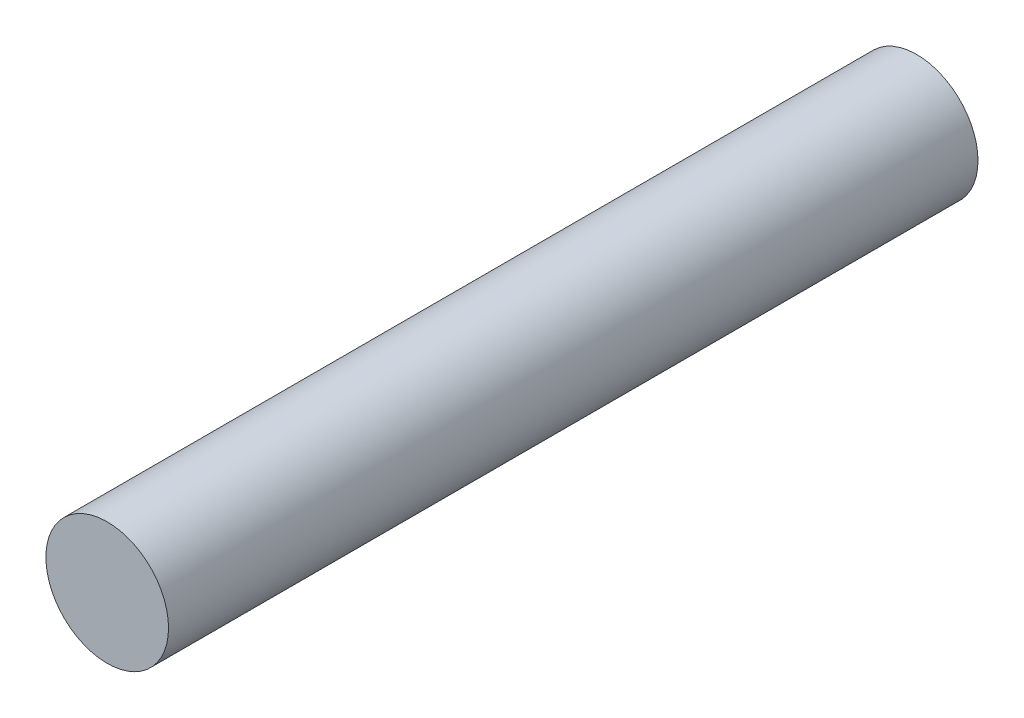
ISO-10303-21;
HEADER;
FILE_DESCRIPTION(('STEP AP214'),'2;1');
FILE_NAME('part.step','',(''),(''),'','','');
FILE_SCHEMA(('AUTOMOTIVE_DESIGN { 1 0 10303 214 1 1 1 1 }'));
ENDSEC;
DATA;
#1=APPLICATION_CONTEXT('core data for automotive mechanical design processes');
#2=APPLICATION_PROTOCOL_DEFINITION('international standard','automotive_design',2000,#1);
#3=PRODUCT_CONTEXT('',#1,'mechanical');
#4=PRODUCT('Part','Part','',(#3));
#5=PRODUCT_RELATED_PRODUCT_CATEGORY('part','',(#4));
#6=PRODUCT_DEFINITION_FORMATION('','',#4);
#7=PRODUCT_DEFINITION_CONTEXT('part definition',#1,'design');
#8=PRODUCT_DEFINITION('design','',#6,#7);
#9=PRODUCT_DEFINITION_SHAPE('','',#8);
#10=(LENGTH_UNIT() NAMED_UNIT(*) SI_UNIT(.MILLI.,.METRE.));
#11=(NAMED_UNIT(*) PLANE_ANGLE_UNIT() SI_UNIT($,.RADIAN.));
#12=(NAMED_UNIT(*) SI_UNIT($,.STERADIAN.) SOLID_ANGLE_UNIT());
#13=UNCERTAINTY_MEASURE_WITH_UNIT(LENGTH_MEASURE(1.E-05),#10,'distance_accuracy_value','');
#14=(GEOMETRIC_REPRESENTATION_CONTEXT(3) GLOBAL_UNCERTAINTY_ASSIGNED_CONTEXT((#13)) GLOBAL_UNIT_ASSIGNED_CONTEXT((#10,
#11,#12)) REPRESENTATION_CONTEXT('',''));
#15=CARTESIAN_POINT('',(0.,0.,0.));
#16=DIRECTION('',(0.,0.,1.));
#17=DIRECTION('',(1.,0.,0.));
#18=AXIS2_PLACEMENT_3D('',#15,#16,#17);
#19=CARTESIAN_POINT('',(-40.983162755083,47.5012018164023,33.));
#20=DIRECTION('',(0.,0.,-1.));
#21=DIRECTION('',(-1.,0.,0.));
#22=AXIS2_PLACEMENT_3D('',#19,#20,#21);
#23=CYLINDRICAL_SURFACE('',#22,2.5);
#24=CARTESIAN_POINT('',(-40.983162755083,47.5012018164023,33.));
#25=DIRECTION('',(0.,0.,1.));
#26=DIRECTION('',(1.,0.,0.));
#27=AXIS2_PLACEMENT_3D('',#24,#25,#26);
#28=CIRCLE('',#27,2.5);
#29=CARTESIAN_POINT('',(-38.483162755083,47.5012018164023,33.));
#30=VERTEX_POINT('',#29);
#31=EDGE_CURVE('E10',#30,#30,#28,.T.);
#32=ORIENTED_EDGE('',*,*,#31,.F.);
#33=EDGE_LOOP('',(#32));
#34=FACE_BOUND('',#33,.T.);
#35=CARTESIAN_POINT('',(-40.983162755083,47.5012018164023,0.));
#36=DIRECTION('',(0.,0.,1.));
#37=DIRECTION('',(1.,0.,0.));
#38=AXIS2_PLACEMENT_3D('',#35,#36,#37);
#39=CIRCLE('',#38,2.5);
#40=CARTESIAN_POINT('',(-38.483162755083,47.5012018164023,0.));
#41=VERTEX_POINT('',#40);
#42=EDGE_CURVE('E38',#41,#41,#39,.T.);
#43=ORIENTED_EDGE('',*,*,#42,.T.);
#44=EDGE_LOOP('',(#43));
#45=FACE_BOUND('',#44,.T.);
#46=ADVANCED_FACE('F35',(#34,#45),#23,.T.);
#47=CARTESIAN_POINT('',(-40.983162755083,47.5012018164023,33.));
#48=DIRECTION('',(0.,0.,1.));
#49=DIRECTION('',(1.,0.,0.));
#50=AXIS2_PLACEMENT_3D('',#47,#48,#49);
#51=PLANE('',#50);
#52=ORIENTED_EDGE('',*,*,#31,.T.);
#53=EDGE_LOOP('',(#52));
#54=FACE_BOUND('',#53,.T.);
#55=ADVANCED_FACE('F50',(#54),#51,.T.);
#56=CARTESIAN_POINT('',(-40.983162755083,47.5012018164023,0.));
#57=DIRECTION('',(0.,0.,1.));
#58=DIRECTION('',(1.,0.,0.));
#59=AXIS2_PLACEMENT_3D('',#56,#57,#58);
#60=PLANE('',#59);
#61=ORIENTED_EDGE('',*,*,#42,.F.);
#62=EDGE_LOOP('',(#61));
#63=FACE_BOUND('',#62,.T.);
#64=ADVANCED_FACE('F48',(#63),#60,.F.);
#65=CLOSED_SHELL('',(#46,#55,#64));
#66=MANIFOLD_SOLID_BREP('B2',#65);
#67=ADVANCED_BREP_SHAPE_REPRESENTATION('',(#18,#66),#14);
#68=SHAPE_DEFINITION_REPRESENTATION(#9,#67);
ENDSEC;
END-ISO-10303-21;
